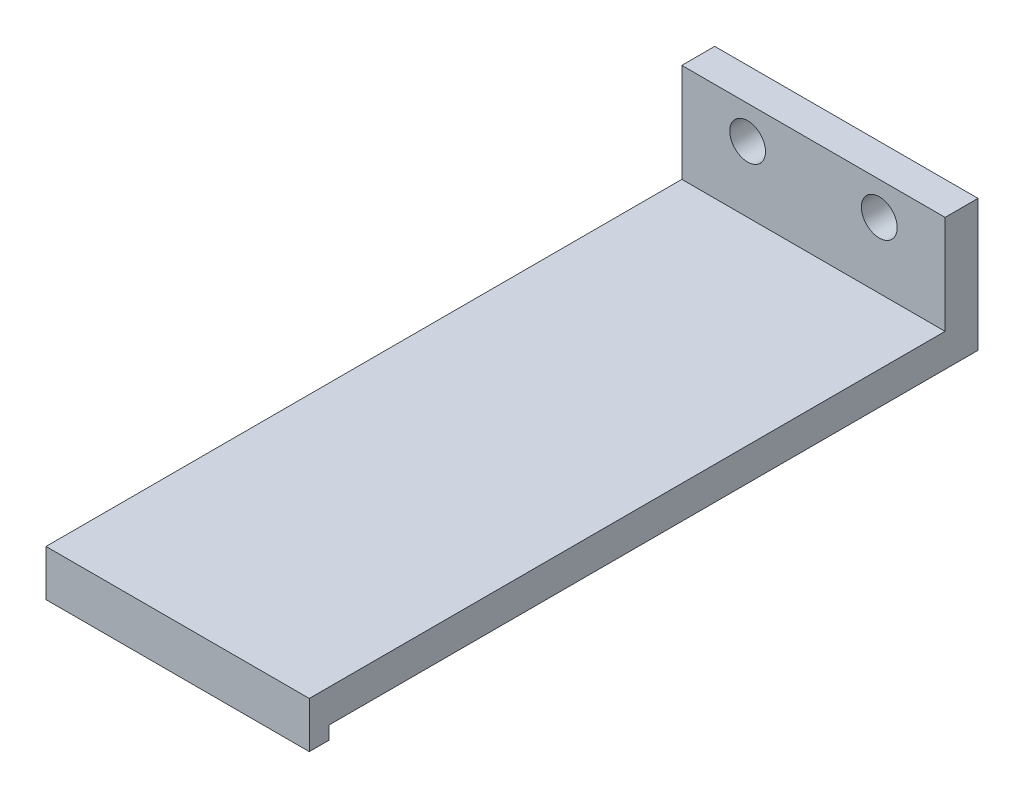
ISO-10303-21;
HEADER;
FILE_DESCRIPTION(('STEP AP214'),'2;1');
FILE_NAME('part.step','',(''),(''),'','','');
FILE_SCHEMA(('AUTOMOTIVE_DESIGN { 1 0 10303 214 1 1 1 1 }'));
ENDSEC;
DATA;
#1=APPLICATION_CONTEXT('core data for automotive mechanical design processes');
#2=APPLICATION_PROTOCOL_DEFINITION('international standard','automotive_design',2000,#1);
#3=PRODUCT_CONTEXT('',#1,'mechanical');
#4=PRODUCT('Part','Part','',(#3));
#5=PRODUCT_RELATED_PRODUCT_CATEGORY('part','',(#4));
#6=PRODUCT_DEFINITION_FORMATION('','',#4);
#7=PRODUCT_DEFINITION_CONTEXT('part definition',#1,'design');
#8=PRODUCT_DEFINITION('design','',#6,#7);
#9=PRODUCT_DEFINITION_SHAPE('','',#8);
#10=(LENGTH_UNIT() NAMED_UNIT(*) SI_UNIT(.MILLI.,.METRE.));
#11=(NAMED_UNIT(*) PLANE_ANGLE_UNIT() SI_UNIT($,.RADIAN.));
#12=(NAMED_UNIT(*) SI_UNIT($,.STERADIAN.) SOLID_ANGLE_UNIT());
#13=UNCERTAINTY_MEASURE_WITH_UNIT(LENGTH_MEASURE(1.E-05),#10,'distance_accuracy_value','');
#14=(GEOMETRIC_REPRESENTATION_CONTEXT(3) GLOBAL_UNCERTAINTY_ASSIGNED_CONTEXT((#13)) GLOBAL_UNIT_ASSIGNED_CONTEXT((#10,
#11,#12)) REPRESENTATION_CONTEXT('',''));
#15=CARTESIAN_POINT('',(0.,0.,0.));
#16=DIRECTION('',(0.,0.,1.));
#17=DIRECTION('',(1.,0.,0.));
#18=AXIS2_PLACEMENT_3D('',#15,#16,#17);
#19=CARTESIAN_POINT('',(-8.30904255319149,-7.12686170212766,3.175));
#20=DIRECTION('',(0.,1.,0.));
#21=DIRECTION('',(-1.,0.,0.));
#22=AXIS2_PLACEMENT_3D('',#19,#20,#21);
#23=PLANE('',#22);
#24=DIRECTION('',(1.,0.,0.));
#25=VECTOR('',#24,1.);
#26=CARTESIAN_POINT('',(-8.30904255319149,-7.12686170212766,62.611));
#27=LINE('',#26,#25);
#28=CARTESIAN_POINT('',(-8.30904255319149,-7.12686170212766,62.611));
#29=VERTEX_POINT('',#28);
#30=CARTESIAN_POINT('',(17.0909574468085,-7.12686170212766,62.611));
#31=VERTEX_POINT('',#30);
#32=EDGE_CURVE('E56',#29,#31,#27,.T.);
#33=ORIENTED_EDGE('',*,*,#32,.F.);
#34=DIRECTION('',(0.,0.,-1.));
#35=VECTOR('',#34,1.);
#36=CARTESIAN_POINT('',(-8.30904255319149,-7.12686170212766,3.175));
#37=LINE('',#36,#35);
#38=CARTESIAN_POINT('',(-8.30904255319149,-7.12686170212766,0.));
#39=VERTEX_POINT('',#38);
#40=EDGE_CURVE('E11',#29,#39,#37,.T.);
#41=ORIENTED_EDGE('',*,*,#40,.T.);
#42=DIRECTION('',(1.,0.,0.));
#43=VECTOR('',#42,1.);
#44=CARTESIAN_POINT('',(-8.30904255319149,-7.12686170212766,0.));
#45=LINE('',#44,#43);
#46=CARTESIAN_POINT('',(17.0909574468085,-7.12686170212766,0.));
#47=VERTEX_POINT('',#46);
#48=EDGE_CURVE('E106',#39,#47,#45,.T.);
#49=ORIENTED_EDGE('',*,*,#48,.T.);
#50=DIRECTION('',(0.,0.,-1.));
#51=VECTOR('',#50,1.);
#52=CARTESIAN_POINT('',(17.0909574468085,-7.12686170212766,3.175));
#53=LINE('',#52,#51);
#54=EDGE_CURVE('E50',#31,#47,#53,.T.);
#55=ORIENTED_EDGE('',*,*,#54,.F.);
#56=EDGE_LOOP('',(#33,#41,#49,#55));
#57=FACE_BOUND('',#56,.T.);
#58=ADVANCED_FACE('F41',(#57),#23,.F.);
#59=CARTESIAN_POINT('',(-8.30904255319149,5.57313829787234,3.175));
#60=DIRECTION('',(1.,0.,0.));
#61=DIRECTION('',(0.,0.,-1.));
#62=AXIS2_PLACEMENT_3D('',#59,#60,#61);
#63=PLANE('',#62);
#64=DIRECTION('',(0.,-1.,0.));
#65=VECTOR('',#64,1.);
#66=CARTESIAN_POINT('',(-8.30904255319149,5.57313829787234,0.));
#67=LINE('',#66,#65);
#68=CARTESIAN_POINT('',(-8.30904255319149,5.57313829787234,0.));
#69=VERTEX_POINT('',#68);
#70=EDGE_CURVE('E163',#69,#39,#67,.T.);
#71=ORIENTED_EDGE('',*,*,#70,.T.);
#72=ORIENTED_EDGE('',*,*,#40,.F.);
#73=DIRECTION('',(0.,1.,0.));
#74=VECTOR('',#73,1.);
#75=CARTESIAN_POINT('',(-8.30904255319149,-33.8681990246948,62.611));
#76=LINE('',#75,#74);
#77=CARTESIAN_POINT('',(-8.30904255319149,-8.39686170212768,62.611));
#78=VERTEX_POINT('',#77);
#79=EDGE_CURVE('E120',#78,#29,#76,.T.);
#80=ORIENTED_EDGE('',*,*,#79,.F.);
#81=DIRECTION('',(0.,0.,1.));
#82=VECTOR('',#81,1.);
#83=CARTESIAN_POINT('',(-8.30904255319149,-8.39686170212768,64.516));
#84=LINE('',#83,#82);
#85=CARTESIAN_POINT('',(-8.30904255319149,-8.39686170212768,64.516));
#86=VERTEX_POINT('',#85);
#87=EDGE_CURVE('E128',#78,#86,#84,.T.);
#88=ORIENTED_EDGE('',*,*,#87,.T.);
#89=DIRECTION('',(0.,1.,0.));
#90=VECTOR('',#89,1.);
#91=CARTESIAN_POINT('',(-8.30904255319149,-7.12686170212766,64.516));
#92=LINE('',#91,#90);
#93=CARTESIAN_POINT('',(-8.30904255319149,-3.95186170212766,64.516));
#94=VERTEX_POINT('',#93);
#95=EDGE_CURVE('E140',#86,#94,#92,.T.);
#96=ORIENTED_EDGE('',*,*,#95,.T.);
#97=DIRECTION('',(0.,0.,-1.));
#98=VECTOR('',#97,1.);
#99=CARTESIAN_POINT('',(-8.30904255319149,-3.95186170212766,90.1136683508479));
#100=LINE('',#99,#98);
#101=CARTESIAN_POINT('',(-8.30904255319149,-3.95186170212766,3.175));
#102=VERTEX_POINT('',#101);
#103=EDGE_CURVE('E148',#94,#102,#100,.T.);
#104=ORIENTED_EDGE('',*,*,#103,.T.);
#105=DIRECTION('',(0.,-1.,0.));
#106=VECTOR('',#105,1.);
#107=CARTESIAN_POINT('',(-8.30904255319149,5.57313829787234,3.175));
#108=LINE('',#107,#106);
#109=CARTESIAN_POINT('',(-8.30904255319149,5.57313829787234,3.175));
#110=VERTEX_POINT('',#109);
#111=EDGE_CURVE('E175',#110,#102,#108,.T.);
#112=ORIENTED_EDGE('',*,*,#111,.F.);
#113=DIRECTION('',(0.,0.,-1.));
#114=VECTOR('',#113,1.);
#115=CARTESIAN_POINT('',(-8.30904255319149,5.57313829787234,3.175));
#116=LINE('',#115,#114);
#117=EDGE_CURVE('E185',#110,#69,#116,.T.);
#118=ORIENTED_EDGE('',*,*,#117,.T.);
#119=EDGE_LOOP('',(#71,#72,#80,#88,#96,#104,#112,#118));
#120=FACE_BOUND('',#119,.T.);
#121=ADVANCED_FACE('F43',(#120),#63,.F.);
#122=CARTESIAN_POINT('',(17.0909574468085,5.57313829787234,3.175));
#123=DIRECTION('',(-1.,0.,0.));
#124=DIRECTION('',(0.,0.,1.));
#125=AXIS2_PLACEMENT_3D('',#122,#123,#124);
#126=PLANE('',#125);
#127=DIRECTION('',(0.,1.,0.));
#128=VECTOR('',#127,1.);
#129=CARTESIAN_POINT('',(17.0909574468085,5.57313829787234,0.));
#130=LINE('',#129,#128);
#131=CARTESIAN_POINT('',(17.0909574468085,5.57313829787234,0.));
#132=VERTEX_POINT('',#131);
#133=EDGE_CURVE('E191',#47,#132,#130,.T.);
#134=ORIENTED_EDGE('',*,*,#133,.T.);
#135=DIRECTION('',(0.,0.,-1.));
#136=VECTOR('',#135,1.);
#137=CARTESIAN_POINT('',(17.0909574468085,5.57313829787234,3.175));
#138=LINE('',#137,#136);
#139=CARTESIAN_POINT('',(17.0909574468085,5.57313829787234,3.175));
#140=VERTEX_POINT('',#139);
#141=EDGE_CURVE('E110',#140,#132,#138,.T.);
#142=ORIENTED_EDGE('',*,*,#141,.F.);
#143=DIRECTION('',(0.,1.,0.));
#144=VECTOR('',#143,1.);
#145=CARTESIAN_POINT('',(17.0909574468085,5.57313829787234,3.175));
#146=LINE('',#145,#144);
#147=CARTESIAN_POINT('',(17.0909574468085,-3.95186170212766,3.175));
#148=VERTEX_POINT('',#147);
#149=EDGE_CURVE('E178',#148,#140,#146,.T.);
#150=ORIENTED_EDGE('',*,*,#149,.F.);
#151=DIRECTION('',(0.,0.,-1.));
#152=VECTOR('',#151,1.);
#153=CARTESIAN_POINT('',(17.0909574468085,-3.95186170212766,90.1136683508479));
#154=LINE('',#153,#152);
#155=CARTESIAN_POINT('',(17.0909574468085,-3.95186170212766,64.516));
#156=VERTEX_POINT('',#155);
#157=EDGE_CURVE('E152',#156,#148,#154,.T.);
#158=ORIENTED_EDGE('',*,*,#157,.F.);
#159=DIRECTION('',(0.,-1.,0.));
#160=VECTOR('',#159,1.);
#161=CARTESIAN_POINT('',(17.0909574468085,-7.12686170212766,64.516));
#162=LINE('',#161,#160);
#163=CARTESIAN_POINT('',(17.0909574468085,-8.39686170212767,64.516));
#164=VERTEX_POINT('',#163);
#165=EDGE_CURVE('E137',#156,#164,#162,.T.);
#166=ORIENTED_EDGE('',*,*,#165,.T.);
#167=DIRECTION('',(0.,0.,1.));
#168=VECTOR('',#167,1.);
#169=CARTESIAN_POINT('',(17.0909574468085,-8.39686170212767,64.516));
#170=LINE('',#169,#168);
#171=CARTESIAN_POINT('',(17.0909574468085,-8.39686170212767,62.611));
#172=VERTEX_POINT('',#171);
#173=EDGE_CURVE('E116',#172,#164,#170,.T.);
#174=ORIENTED_EDGE('',*,*,#173,.F.);
#175=DIRECTION('',(0.,1.,0.));
#176=VECTOR('',#175,1.);
#177=CARTESIAN_POINT('',(17.0909574468085,-33.8681990246948,62.611));
#178=LINE('',#177,#176);
#179=EDGE_CURVE('E113',#172,#31,#178,.T.);
#180=ORIENTED_EDGE('',*,*,#179,.T.);
#181=ORIENTED_EDGE('',*,*,#54,.T.);
#182=EDGE_LOOP('',(#134,#142,#150,#158,#166,#174,#180,#181));
#183=FACE_BOUND('',#182,.T.);
#184=ADVANCED_FACE('F114',(#183),#126,.F.);
#185=CARTESIAN_POINT('',(-8.30904255319149,5.57313829787234,3.175));
#186=DIRECTION('',(0.,-1.,0.));
#187=DIRECTION('',(0.,0.,-1.));
#188=AXIS2_PLACEMENT_3D('',#185,#186,#187);
#189=PLANE('',#188);
#190=DIRECTION('',(-1.,0.,0.));
#191=VECTOR('',#190,1.);
#192=CARTESIAN_POINT('',(-8.30904255319149,5.57313829787234,0.));
#193=LINE('',#192,#191);
#194=EDGE_CURVE('E179',#132,#69,#193,.T.);
#195=ORIENTED_EDGE('',*,*,#194,.T.);
#196=ORIENTED_EDGE('',*,*,#117,.F.);
#197=DIRECTION('',(-1.,0.,0.));
#198=VECTOR('',#197,1.);
#199=CARTESIAN_POINT('',(-8.30904255319149,5.57313829787234,3.175));
#200=LINE('',#199,#198);
#201=EDGE_CURVE('E182',#140,#110,#200,.T.);
#202=ORIENTED_EDGE('',*,*,#201,.F.);
#203=ORIENTED_EDGE('',*,*,#141,.T.);
#204=EDGE_LOOP('',(#195,#196,#202,#203));
#205=FACE_BOUND('',#204,.T.);
#206=ADVANCED_FACE('F205',(#205),#189,.F.);
#207=CARTESIAN_POINT('',(0.,0.,3.175));
#208=DIRECTION('',(0.,0.,1.));
#209=DIRECTION('',(1.,0.,0.));
#210=AXIS2_PLACEMENT_3D('',#207,#208,#209);
#211=PLANE('',#210);
#212=DIRECTION('',(-1.,0.,0.));
#213=VECTOR('',#212,1.);
#214=CARTESIAN_POINT('',(-8.30904255319149,-3.95186170212766,3.175));
#215=LINE('',#214,#213);
#216=EDGE_CURVE('E64',#148,#102,#215,.T.);
#217=ORIENTED_EDGE('',*,*,#216,.F.);
#218=ORIENTED_EDGE('',*,*,#149,.T.);
#219=ORIENTED_EDGE('',*,*,#201,.T.);
#220=ORIENTED_EDGE('',*,*,#111,.T.);
#221=EDGE_LOOP('',(#217,#218,#219,#220));
#222=FACE_BOUND('',#221,.T.);
#223=CARTESIAN_POINT('',(10.7409574468085,2.39813829787234,3.175));
#224=DIRECTION('',(0.,0.,1.));
#225=DIRECTION('',(1.,0.,0.));
#226=AXIS2_PLACEMENT_3D('',#223,#224,#225);
#227=CIRCLE('',#226,1.7272);
#228=CARTESIAN_POINT('',(12.4681574468085,2.39813829787234,3.175));
#229=VERTEX_POINT('',#228);
#230=EDGE_CURVE('E164',#229,#229,#227,.T.);
#231=ORIENTED_EDGE('',*,*,#230,.F.);
#232=EDGE_LOOP('',(#231));
#233=FACE_BOUND('',#232,.T.);
#234=CARTESIAN_POINT('',(-1.95904255319149,2.39813829787234,3.175));
#235=DIRECTION('',(0.,0.,1.));
#236=DIRECTION('',(1.,0.,0.));
#237=AXIS2_PLACEMENT_3D('',#234,#235,#236);
#238=CIRCLE('',#237,1.7272);
#239=CARTESIAN_POINT('',(-0.231842553191487,2.39813829787234,3.175));
#240=VERTEX_POINT('',#239);
#241=EDGE_CURVE('E145',#240,#240,#238,.T.);
#242=ORIENTED_EDGE('',*,*,#241,.F.);
#243=EDGE_LOOP('',(#242));
#244=FACE_BOUND('',#243,.T.);
#245=ADVANCED_FACE('F213',(#222,#233,#244),#211,.T.);
#246=CARTESIAN_POINT('',(0.,0.,0.));
#247=DIRECTION('',(0.,0.,1.));
#248=DIRECTION('',(1.,0.,0.));
#249=AXIS2_PLACEMENT_3D('',#246,#247,#248);
#250=PLANE('',#249);
#251=CARTESIAN_POINT('',(10.7409574468085,2.39813829787234,0.));
#252=DIRECTION('',(0.,0.,1.));
#253=DIRECTION('',(1.,0.,0.));
#254=AXIS2_PLACEMENT_3D('',#251,#252,#253);
#255=CIRCLE('',#254,1.7272);
#256=CARTESIAN_POINT('',(12.4681574468085,2.39813829787234,0.));
#257=VERTEX_POINT('',#256);
#258=EDGE_CURVE('E159',#257,#257,#255,.T.);
#259=ORIENTED_EDGE('',*,*,#258,.T.);
#260=EDGE_LOOP('',(#259));
#261=FACE_BOUND('',#260,.T.);
#262=CARTESIAN_POINT('',(-1.95904255319149,2.39813829787234,0.));
#263=DIRECTION('',(0.,0.,1.));
#264=DIRECTION('',(1.,0.,0.));
#265=AXIS2_PLACEMENT_3D('',#262,#263,#264);
#266=CIRCLE('',#265,1.7272);
#267=CARTESIAN_POINT('',(-0.231842553191487,2.39813829787234,0.));
#268=VERTEX_POINT('',#267);
#269=EDGE_CURVE('E168',#268,#268,#266,.T.);
#270=ORIENTED_EDGE('',*,*,#269,.T.);
#271=EDGE_LOOP('',(#270));
#272=FACE_BOUND('',#271,.T.);
#273=ORIENTED_EDGE('',*,*,#70,.F.);
#274=ORIENTED_EDGE('',*,*,#194,.F.);
#275=ORIENTED_EDGE('',*,*,#133,.F.);
#276=ORIENTED_EDGE('',*,*,#48,.F.);
#277=EDGE_LOOP('',(#273,#274,#275,#276));
#278=FACE_BOUND('',#277,.T.);
#279=ADVANCED_FACE('F209',(#261,#272,#278),#250,.F.);
#280=CARTESIAN_POINT('',(-1.95904255319149,2.39813829787234,0.));
#281=DIRECTION('',(0.,0.,1.));
#282=DIRECTION('',(1.,0.,0.));
#283=AXIS2_PLACEMENT_3D('',#280,#281,#282);
#284=CYLINDRICAL_SURFACE('',#283,1.7272);
#285=ORIENTED_EDGE('',*,*,#269,.F.);
#286=EDGE_LOOP('',(#285));
#287=FACE_BOUND('',#286,.T.);
#288=ORIENTED_EDGE('',*,*,#241,.T.);
#289=EDGE_LOOP('',(#288));
#290=FACE_BOUND('',#289,.T.);
#291=ADVANCED_FACE('F246',(#287,#290),#284,.F.);
#292=CARTESIAN_POINT('',(10.7409574468085,2.39813829787234,0.));
#293=DIRECTION('',(0.,0.,1.));
#294=DIRECTION('',(1.,0.,0.));
#295=AXIS2_PLACEMENT_3D('',#292,#293,#294);
#296=CYLINDRICAL_SURFACE('',#295,1.7272);
#297=ORIENTED_EDGE('',*,*,#258,.F.);
#298=EDGE_LOOP('',(#297));
#299=FACE_BOUND('',#298,.T.);
#300=ORIENTED_EDGE('',*,*,#230,.T.);
#301=EDGE_LOOP('',(#300));
#302=FACE_BOUND('',#301,.T.);
#303=ADVANCED_FACE('F252',(#299,#302),#296,.F.);
#304=CARTESIAN_POINT('',(-8.30904255319149,-3.95186170212766,90.1136683508479));
#305=DIRECTION('',(0.,-1.,0.));
#306=DIRECTION('',(0.,0.,-1.));
#307=AXIS2_PLACEMENT_3D('',#304,#305,#306);
#308=PLANE('',#307);
#309=ORIENTED_EDGE('',*,*,#103,.F.);
#310=DIRECTION('',(1.,0.,0.));
#311=VECTOR('',#310,1.);
#312=CARTESIAN_POINT('',(-8.30904255319149,-3.95186170212766,64.516));
#313=LINE('',#312,#311);
#314=EDGE_CURVE('E141',#94,#156,#313,.T.);
#315=ORIENTED_EDGE('',*,*,#314,.T.);
#316=ORIENTED_EDGE('',*,*,#157,.T.);
#317=ORIENTED_EDGE('',*,*,#216,.T.);
#318=EDGE_LOOP('',(#309,#315,#316,#317));
#319=FACE_BOUND('',#318,.T.);
#320=ADVANCED_FACE('F217',(#319),#308,.F.);
#321=CARTESIAN_POINT('',(19.1264825067282,-38.8790396318119,64.516));
#322=DIRECTION('',(0.,0.,-1.));
#323=DIRECTION('',(1.,0.,0.));
#324=AXIS2_PLACEMENT_3D('',#321,#322,#323);
#325=PLANE('',#324);
#326=ORIENTED_EDGE('',*,*,#95,.F.);
#327=DIRECTION('',(-1.,0.,0.));
#328=VECTOR('',#327,1.);
#329=CARTESIAN_POINT('',(-8.30904255319149,-8.39686170212768,64.516));
#330=LINE('',#329,#328);
#331=EDGE_CURVE('E133',#164,#86,#330,.T.);
#332=ORIENTED_EDGE('',*,*,#331,.F.);
#333=ORIENTED_EDGE('',*,*,#165,.F.);
#334=ORIENTED_EDGE('',*,*,#314,.F.);
#335=EDGE_LOOP('',(#326,#332,#333,#334));
#336=FACE_BOUND('',#335,.T.);
#337=ADVANCED_FACE('F219',(#336),#325,.F.);
#338=CARTESIAN_POINT('',(-8.30904255319149,-33.8681990246948,62.611));
#339=DIRECTION('',(0.,0.,1.));
#340=DIRECTION('',(1.,0.,0.));
#341=AXIS2_PLACEMENT_3D('',#338,#339,#340);
#342=PLANE('',#341);
#343=ORIENTED_EDGE('',*,*,#179,.F.);
#344=DIRECTION('',(-1.,0.,0.));
#345=VECTOR('',#344,1.);
#346=CARTESIAN_POINT('',(-8.30904255319149,-8.39686170212768,62.611));
#347=LINE('',#346,#345);
#348=EDGE_CURVE('E224',#172,#78,#347,.T.);
#349=ORIENTED_EDGE('',*,*,#348,.T.);
#350=ORIENTED_EDGE('',*,*,#79,.T.);
#351=ORIENTED_EDGE('',*,*,#32,.T.);
#352=EDGE_LOOP('',(#343,#349,#350,#351));
#353=FACE_BOUND('',#352,.T.);
#354=ADVANCED_FACE('F123',(#353),#342,.F.);
#355=CARTESIAN_POINT('',(19.1264825067282,-8.39686170212767,55.792241476));
#356=DIRECTION('',(0.,1.,0.));
#357=DIRECTION('',(-1.,0.,0.));
#358=AXIS2_PLACEMENT_3D('',#355,#356,#357);
#359=PLANE('',#358);
#360=ORIENTED_EDGE('',*,*,#348,.F.);
#361=ORIENTED_EDGE('',*,*,#173,.T.);
#362=ORIENTED_EDGE('',*,*,#331,.T.);
#363=ORIENTED_EDGE('',*,*,#87,.F.);
#364=EDGE_LOOP('',(#360,#361,#362,#363));
#365=FACE_BOUND('',#364,.T.);
#366=ADVANCED_FACE('F228',(#365),#359,.F.);
#367=CLOSED_SHELL('',(#58,#121,#184,#206,#245,#279,#291,#303,#320,#337,#354,#366));
#368=MANIFOLD_SOLID_BREP('B2',#367);
#369=ADVANCED_BREP_SHAPE_REPRESENTATION('',(#18,#368),#14);
#370=SHAPE_DEFINITION_REPRESENTATION(#9,#369);
ENDSEC;
END-ISO-10303-21;
